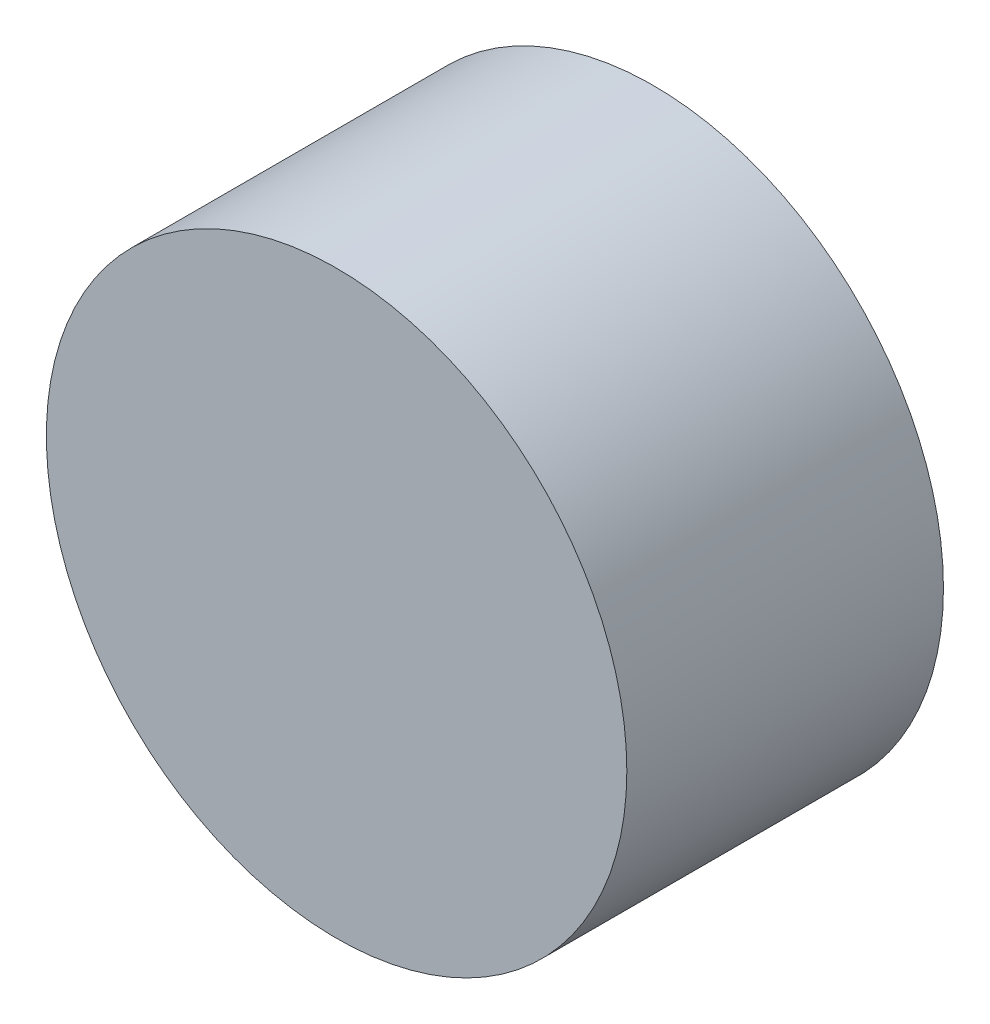
ISO-10303-21;
HEADER;
FILE_DESCRIPTION(('STEP AP214'),'2;1');
FILE_NAME('part.step','',(''),(''),'','','');
FILE_SCHEMA(('AUTOMOTIVE_DESIGN { 1 0 10303 214 1 1 1 1 }'));
ENDSEC;
DATA;
#1=APPLICATION_CONTEXT('core data for automotive mechanical design processes');
#2=APPLICATION_PROTOCOL_DEFINITION('international standard','automotive_design',2000,#1);
#3=PRODUCT_CONTEXT('',#1,'mechanical');
#4=PRODUCT('Part','Part','',(#3));
#5=PRODUCT_RELATED_PRODUCT_CATEGORY('part','',(#4));
#6=PRODUCT_DEFINITION_FORMATION('','',#4);
#7=PRODUCT_DEFINITION_CONTEXT('part definition',#1,'design');
#8=PRODUCT_DEFINITION('design','',#6,#7);
#9=PRODUCT_DEFINITION_SHAPE('','',#8);
#10=(LENGTH_UNIT() NAMED_UNIT(*) SI_UNIT(.MILLI.,.METRE.));
#11=(NAMED_UNIT(*) PLANE_ANGLE_UNIT() SI_UNIT($,.RADIAN.));
#12=(NAMED_UNIT(*) SI_UNIT($,.STERADIAN.) SOLID_ANGLE_UNIT());
#13=UNCERTAINTY_MEASURE_WITH_UNIT(LENGTH_MEASURE(1.E-05),#10,'distance_accuracy_value','');
#14=(GEOMETRIC_REPRESENTATION_CONTEXT(3) GLOBAL_UNCERTAINTY_ASSIGNED_CONTEXT((#13)) GLOBAL_UNIT_ASSIGNED_CONTEXT((#10,
#11,#12)) REPRESENTATION_CONTEXT('',''));
#15=CARTESIAN_POINT('',(0.,0.,0.));
#16=DIRECTION('',(0.,0.,1.));
#17=DIRECTION('',(1.,0.,0.));
#18=AXIS2_PLACEMENT_3D('',#15,#16,#17);
#19=CARTESIAN_POINT('',(0.,0.,60.));
#20=DIRECTION('',(0.,0.,-1.));
#21=DIRECTION('',(-1.,0.,0.));
#22=AXIS2_PLACEMENT_3D('',#19,#20,#21);
#23=CYLINDRICAL_SURFACE('',#22,55.);
#24=CARTESIAN_POINT('',(0.,0.,60.));
#25=DIRECTION('',(0.,0.,1.));
#26=DIRECTION('',(1.,0.,0.));
#27=AXIS2_PLACEMENT_3D('',#24,#25,#26);
#28=CIRCLE('',#27,55.);
#29=CARTESIAN_POINT('',(55.,0.,60.));
#30=VERTEX_POINT('',#29);
#31=EDGE_CURVE('E10',#30,#30,#28,.T.);
#32=ORIENTED_EDGE('',*,*,#31,.F.);
#33=EDGE_LOOP('',(#32));
#34=FACE_BOUND('',#33,.T.);
#35=CARTESIAN_POINT('',(0.,0.,0.));
#36=DIRECTION('',(0.,0.,1.));
#37=DIRECTION('',(1.,0.,0.));
#38=AXIS2_PLACEMENT_3D('',#35,#36,#37);
#39=CIRCLE('',#38,55.);
#40=CARTESIAN_POINT('',(55.,0.,0.));
#41=VERTEX_POINT('',#40);
#42=EDGE_CURVE('E34',#41,#41,#39,.T.);
#43=ORIENTED_EDGE('',*,*,#42,.T.);
#44=EDGE_LOOP('',(#43));
#45=FACE_BOUND('',#44,.T.);
#46=ADVANCED_FACE('F31',(#34,#45),#23,.T.);
#47=CARTESIAN_POINT('',(0.,0.,60.));
#48=DIRECTION('',(0.,0.,1.));
#49=DIRECTION('',(1.,0.,0.));
#50=AXIS2_PLACEMENT_3D('',#47,#48,#49);
#51=PLANE('',#50);
#52=ORIENTED_EDGE('',*,*,#31,.T.);
#53=EDGE_LOOP('',(#52));
#54=FACE_BOUND('',#53,.T.);
#55=ADVANCED_FACE('F46',(#54),#51,.T.);
#56=CARTESIAN_POINT('',(0.,0.,0.));
#57=DIRECTION('',(0.,0.,1.));
#58=DIRECTION('',(1.,0.,0.));
#59=AXIS2_PLACEMENT_3D('',#56,#57,#58);
#60=PLANE('',#59);
#61=ORIENTED_EDGE('',*,*,#42,.F.);
#62=EDGE_LOOP('',(#61));
#63=FACE_BOUND('',#62,.T.);
#64=ADVANCED_FACE('F44',(#63),#60,.F.);
#65=CLOSED_SHELL('',(#46,#55,#64));
#66=MANIFOLD_SOLID_BREP('B2',#65);
#67=ADVANCED_BREP_SHAPE_REPRESENTATION('',(#18,#66),#14);
#68=SHAPE_DEFINITION_REPRESENTATION(#9,#67);
ENDSEC;
END-ISO-10303-21;
